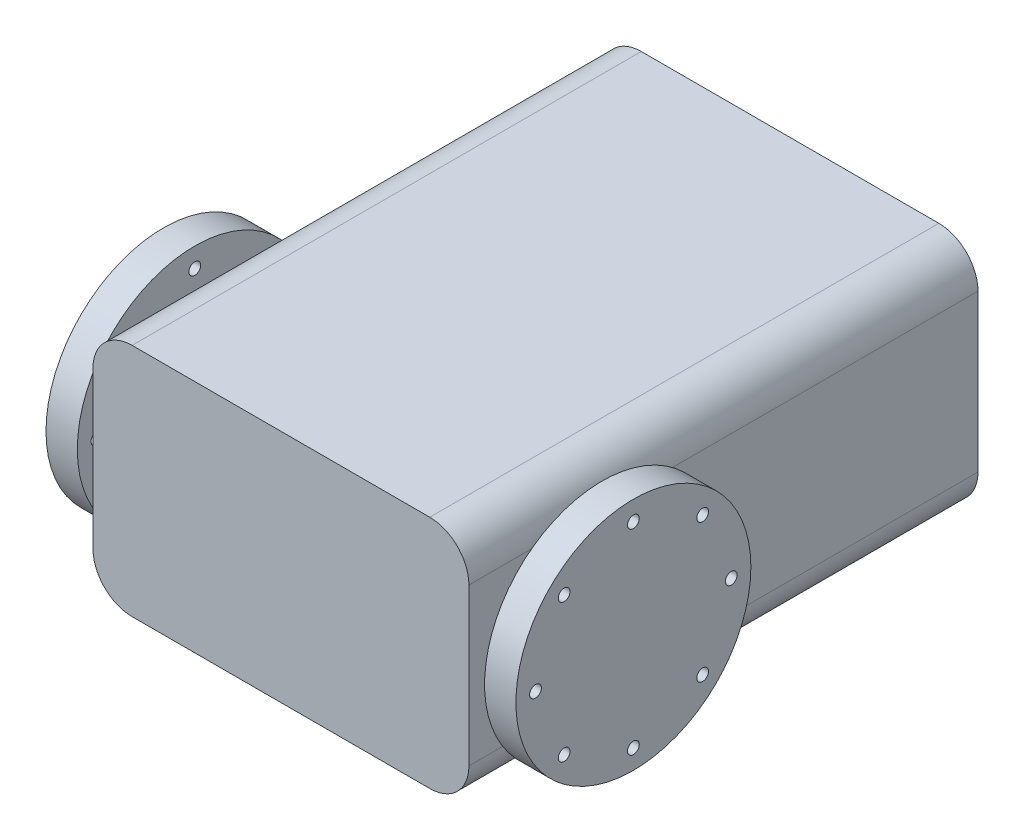
ISO-10303-21;
HEADER;
FILE_DESCRIPTION(('STEP AP214'),'2;1');
FILE_NAME('part.step','',(''),(''),'','','');
FILE_SCHEMA(('AUTOMOTIVE_DESIGN { 1 0 10303 214 1 1 1 1 }'));
ENDSEC;
DATA;
#1=APPLICATION_CONTEXT('core data for automotive mechanical design processes');
#2=APPLICATION_PROTOCOL_DEFINITION('international standard','automotive_design',2000,#1);
#3=PRODUCT_CONTEXT('',#1,'mechanical');
#4=PRODUCT('Part','Part','',(#3));
#5=PRODUCT_RELATED_PRODUCT_CATEGORY('part','',(#4));
#6=PRODUCT_DEFINITION_FORMATION('','',#4);
#7=PRODUCT_DEFINITION_CONTEXT('part definition',#1,'design');
#8=PRODUCT_DEFINITION('design','',#6,#7);
#9=PRODUCT_DEFINITION_SHAPE('','',#8);
#10=(LENGTH_UNIT() NAMED_UNIT(*) SI_UNIT(.MILLI.,.METRE.));
#11=(NAMED_UNIT(*) PLANE_ANGLE_UNIT() SI_UNIT($,.RADIAN.));
#12=(NAMED_UNIT(*) SI_UNIT($,.STERADIAN.) SOLID_ANGLE_UNIT());
#13=UNCERTAINTY_MEASURE_WITH_UNIT(LENGTH_MEASURE(1.E-05),#10,'distance_accuracy_value','');
#14=(GEOMETRIC_REPRESENTATION_CONTEXT(3) GLOBAL_UNCERTAINTY_ASSIGNED_CONTEXT((#13)) GLOBAL_UNIT_ASSIGNED_CONTEXT((#10,
#11,#12)) REPRESENTATION_CONTEXT('',''));
#15=CARTESIAN_POINT('',(0.,0.,0.));
#16=DIRECTION('',(0.,0.,1.));
#17=DIRECTION('',(1.,0.,0.));
#18=AXIS2_PLACEMENT_3D('',#15,#16,#17);
#19=CARTESIAN_POINT('',(19.,10.,32.5));
#20=DIRECTION('',(0.,0.,-1.));
#21=DIRECTION('',(-1.,0.,0.));
#22=AXIS2_PLACEMENT_3D('',#19,#20,#21);
#23=CYLINDRICAL_SURFACE('',#22,5.);
#24=CARTESIAN_POINT('',(19.,10.,-32.5));
#25=DIRECTION('',(0.,0.,1.));
#26=DIRECTION('',(-1.,0.,0.));
#27=AXIS2_PLACEMENT_3D('',#24,#25,#26);
#28=CIRCLE('',#27,5.);
#29=CARTESIAN_POINT('',(24.,10.,-32.5));
#30=VERTEX_POINT('',#29);
#31=CARTESIAN_POINT('',(19.,15.,-32.5));
#32=VERTEX_POINT('',#31);
#33=EDGE_CURVE('E134',#30,#32,#28,.T.);
#34=ORIENTED_EDGE('',*,*,#33,.T.);
#35=DIRECTION('',(0.,0.,-1.));
#36=VECTOR('',#35,1.);
#37=CARTESIAN_POINT('',(19.,15.,32.5));
#38=LINE('',#37,#36);
#39=CARTESIAN_POINT('',(19.,15.,32.5));
#40=VERTEX_POINT('',#39);
#41=EDGE_CURVE('E45',#40,#32,#38,.T.);
#42=ORIENTED_EDGE('',*,*,#41,.F.);
#43=CARTESIAN_POINT('',(19.,10.,32.5));
#44=DIRECTION('',(0.,0.,1.));
#45=DIRECTION('',(-1.,0.,0.));
#46=AXIS2_PLACEMENT_3D('',#43,#44,#45);
#47=CIRCLE('',#46,5.);
#48=CARTESIAN_POINT('',(24.,10.,32.5));
#49=VERTEX_POINT('',#48);
#50=EDGE_CURVE('E149',#49,#40,#47,.T.);
#51=ORIENTED_EDGE('',*,*,#50,.F.);
#52=DIRECTION('',(0.,0.,-1.));
#53=VECTOR('',#52,1.);
#54=CARTESIAN_POINT('',(24.,10.,32.5));
#55=LINE('',#54,#53);
#56=EDGE_CURVE('E130',#49,#30,#55,.T.);
#57=ORIENTED_EDGE('',*,*,#56,.T.);
#58=EDGE_LOOP('',(#34,#42,#51,#57));
#59=FACE_BOUND('',#58,.T.);
#60=ADVANCED_FACE('F37',(#59),#23,.T.);
#61=CARTESIAN_POINT('',(-19.,15.,32.5));
#62=DIRECTION('',(0.,-1.,0.));
#63=DIRECTION('',(0.,0.,-1.));
#64=AXIS2_PLACEMENT_3D('',#61,#62,#63);
#65=PLANE('',#64);
#66=DIRECTION('',(-1.,0.,0.));
#67=VECTOR('',#66,1.);
#68=CARTESIAN_POINT('',(-19.,15.,-32.5));
#69=LINE('',#68,#67);
#70=CARTESIAN_POINT('',(-19.,15.,-32.5));
#71=VERTEX_POINT('',#70);
#72=EDGE_CURVE('E137',#32,#71,#69,.T.);
#73=ORIENTED_EDGE('',*,*,#72,.T.);
#74=DIRECTION('',(0.,0.,-1.));
#75=VECTOR('',#74,1.);
#76=CARTESIAN_POINT('',(-19.,15.,32.5));
#77=LINE('',#76,#75);
#78=CARTESIAN_POINT('',(-19.,15.,32.5));
#79=VERTEX_POINT('',#78);
#80=EDGE_CURVE('E159',#79,#71,#77,.T.);
#81=ORIENTED_EDGE('',*,*,#80,.F.);
#82=DIRECTION('',(-1.,0.,0.));
#83=VECTOR('',#82,1.);
#84=CARTESIAN_POINT('',(-19.,15.,32.5));
#85=LINE('',#84,#83);
#86=EDGE_CURVE('E97',#40,#79,#85,.T.);
#87=ORIENTED_EDGE('',*,*,#86,.F.);
#88=ORIENTED_EDGE('',*,*,#41,.T.);
#89=EDGE_LOOP('',(#73,#81,#87,#88));
#90=FACE_BOUND('',#89,.T.);
#91=ADVANCED_FACE('F162',(#90),#65,.F.);
#92=CARTESIAN_POINT('',(-19.,10.,32.5));
#93=DIRECTION('',(0.,0.,-1.));
#94=DIRECTION('',(-1.,0.,0.));
#95=AXIS2_PLACEMENT_3D('',#92,#93,#94);
#96=CYLINDRICAL_SURFACE('',#95,5.);
#97=CARTESIAN_POINT('',(-19.,10.,-32.5));
#98=DIRECTION('',(0.,0.,1.));
#99=DIRECTION('',(1.,0.,0.));
#100=AXIS2_PLACEMENT_3D('',#97,#98,#99);
#101=CIRCLE('',#100,5.);
#102=CARTESIAN_POINT('',(-24.,10.,-32.5));
#103=VERTEX_POINT('',#102);
#104=EDGE_CURVE('E140',#71,#103,#101,.T.);
#105=ORIENTED_EDGE('',*,*,#104,.T.);
#106=DIRECTION('',(0.,0.,-1.));
#107=VECTOR('',#106,1.);
#108=CARTESIAN_POINT('',(-24.,10.,32.5));
#109=LINE('',#108,#107);
#110=CARTESIAN_POINT('',(-24.,10.,32.5));
#111=VERTEX_POINT('',#110);
#112=EDGE_CURVE('E156',#111,#103,#109,.T.);
#113=ORIENTED_EDGE('',*,*,#112,.F.);
#114=CARTESIAN_POINT('',(-19.,10.,32.5));
#115=DIRECTION('',(0.,0.,1.));
#116=DIRECTION('',(1.,0.,0.));
#117=AXIS2_PLACEMENT_3D('',#114,#115,#116);
#118=CIRCLE('',#117,5.);
#119=EDGE_CURVE('E180',#79,#111,#118,.T.);
#120=ORIENTED_EDGE('',*,*,#119,.F.);
#121=ORIENTED_EDGE('',*,*,#80,.T.);
#122=EDGE_LOOP('',(#105,#113,#120,#121));
#123=FACE_BOUND('',#122,.T.);
#124=ADVANCED_FACE('F173',(#123),#96,.T.);
#125=CARTESIAN_POINT('',(-24.,-10.,32.5));
#126=DIRECTION('',(1.,0.,0.));
#127=DIRECTION('',(0.,0.,-1.));
#128=AXIS2_PLACEMENT_3D('',#125,#126,#127);
#129=PLANE('',#128);
#130=CARTESIAN_POINT('',(-24.,0.,17.5));
#131=DIRECTION('',(1.,0.,0.));
#132=DIRECTION('',(0.,0.,-1.));
#133=AXIS2_PLACEMENT_3D('',#130,#131,#132);
#134=CIRCLE('',#133,7.5);
#135=CARTESIAN_POINT('',(-24.,0.,10.));
#136=VERTEX_POINT('',#135);
#137=EDGE_CURVE('E192',#136,#136,#134,.T.);
#138=ORIENTED_EDGE('',*,*,#137,.T.);
#139=EDGE_LOOP('',(#138));
#140=FACE_BOUND('',#139,.T.);
#141=DIRECTION('',(0.,-1.,0.));
#142=VECTOR('',#141,1.);
#143=CARTESIAN_POINT('',(-24.,-10.,-32.5));
#144=LINE('',#143,#142);
#145=CARTESIAN_POINT('',(-24.,-10.,-32.5));
#146=VERTEX_POINT('',#145);
#147=EDGE_CURVE('E142',#103,#146,#144,.T.);
#148=ORIENTED_EDGE('',*,*,#147,.T.);
#149=DIRECTION('',(0.,0.,-1.));
#150=VECTOR('',#149,1.);
#151=CARTESIAN_POINT('',(-24.,-10.,32.5));
#152=LINE('',#151,#150);
#153=CARTESIAN_POINT('',(-24.,-10.,32.5));
#154=VERTEX_POINT('',#153);
#155=EDGE_CURVE('E153',#154,#146,#152,.T.);
#156=ORIENTED_EDGE('',*,*,#155,.F.);
#157=DIRECTION('',(0.,-1.,0.));
#158=VECTOR('',#157,1.);
#159=CARTESIAN_POINT('',(-24.,-10.,32.5));
#160=LINE('',#159,#158);
#161=EDGE_CURVE('E179',#111,#154,#160,.T.);
#162=ORIENTED_EDGE('',*,*,#161,.F.);
#163=ORIENTED_EDGE('',*,*,#112,.T.);
#164=EDGE_LOOP('',(#148,#156,#162,#163));
#165=FACE_BOUND('',#164,.T.);
#166=ADVANCED_FACE('F177',(#140,#165),#129,.F.);
#167=CARTESIAN_POINT('',(-19.,-10.,32.5));
#168=DIRECTION('',(0.,0.,-1.));
#169=DIRECTION('',(-1.,0.,0.));
#170=AXIS2_PLACEMENT_3D('',#167,#168,#169);
#171=CYLINDRICAL_SURFACE('',#170,5.);
#172=CARTESIAN_POINT('',(-19.,-10.,-32.5));
#173=DIRECTION('',(0.,0.,1.));
#174=DIRECTION('',(-1.,0.,0.));
#175=AXIS2_PLACEMENT_3D('',#172,#173,#174);
#176=CIRCLE('',#175,5.);
#177=CARTESIAN_POINT('',(-19.,-15.,-32.5));
#178=VERTEX_POINT('',#177);
#179=EDGE_CURVE('E144',#146,#178,#176,.T.);
#180=ORIENTED_EDGE('',*,*,#179,.T.);
#181=DIRECTION('',(0.,0.,-1.));
#182=VECTOR('',#181,1.);
#183=CARTESIAN_POINT('',(-19.,-15.,32.5));
#184=LINE('',#183,#182);
#185=CARTESIAN_POINT('',(-19.,-15.,32.5));
#186=VERTEX_POINT('',#185);
#187=EDGE_CURVE('E125',#186,#178,#184,.T.);
#188=ORIENTED_EDGE('',*,*,#187,.F.);
#189=CARTESIAN_POINT('',(-19.,-10.,32.5));
#190=DIRECTION('',(0.,0.,1.));
#191=DIRECTION('',(-1.,0.,0.));
#192=AXIS2_PLACEMENT_3D('',#189,#190,#191);
#193=CIRCLE('',#192,5.);
#194=EDGE_CURVE('E116',#154,#186,#193,.T.);
#195=ORIENTED_EDGE('',*,*,#194,.F.);
#196=ORIENTED_EDGE('',*,*,#155,.T.);
#197=EDGE_LOOP('',(#180,#188,#195,#196));
#198=FACE_BOUND('',#197,.T.);
#199=ADVANCED_FACE('F350',(#198),#171,.T.);
#200=CARTESIAN_POINT('',(-19.,-15.,32.5));
#201=DIRECTION('',(0.,1.,0.));
#202=DIRECTION('',(0.,0.,1.));
#203=AXIS2_PLACEMENT_3D('',#200,#201,#202);
#204=PLANE('',#203);
#205=DIRECTION('',(1.,0.,0.));
#206=VECTOR('',#205,1.);
#207=CARTESIAN_POINT('',(-19.,-15.,-32.5));
#208=LINE('',#207,#206);
#209=CARTESIAN_POINT('',(19.,-15.,-32.5));
#210=VERTEX_POINT('',#209);
#211=EDGE_CURVE('E124',#178,#210,#208,.T.);
#212=ORIENTED_EDGE('',*,*,#211,.T.);
#213=DIRECTION('',(0.,0.,-1.));
#214=VECTOR('',#213,1.);
#215=CARTESIAN_POINT('',(19.,-15.,32.5));
#216=LINE('',#215,#214);
#217=CARTESIAN_POINT('',(19.,-15.,32.5));
#218=VERTEX_POINT('',#217);
#219=EDGE_CURVE('E121',#218,#210,#216,.T.);
#220=ORIENTED_EDGE('',*,*,#219,.F.);
#221=DIRECTION('',(1.,0.,0.));
#222=VECTOR('',#221,1.);
#223=CARTESIAN_POINT('',(-19.,-15.,32.5));
#224=LINE('',#223,#222);
#225=EDGE_CURVE('E110',#186,#218,#224,.T.);
#226=ORIENTED_EDGE('',*,*,#225,.F.);
#227=ORIENTED_EDGE('',*,*,#187,.T.);
#228=EDGE_LOOP('',(#212,#220,#226,#227));
#229=FACE_BOUND('',#228,.T.);
#230=ADVANCED_FACE('F122',(#229),#204,.F.);
#231=CARTESIAN_POINT('',(19.,-10.,32.5));
#232=DIRECTION('',(0.,0.,-1.));
#233=DIRECTION('',(-1.,0.,0.));
#234=AXIS2_PLACEMENT_3D('',#231,#232,#233);
#235=CYLINDRICAL_SURFACE('',#234,5.);
#236=CARTESIAN_POINT('',(19.,-10.,-32.5));
#237=DIRECTION('',(0.,0.,1.));
#238=DIRECTION('',(1.,0.,0.));
#239=AXIS2_PLACEMENT_3D('',#236,#237,#238);
#240=CIRCLE('',#239,5.);
#241=CARTESIAN_POINT('',(24.,-10.,-32.5));
#242=VERTEX_POINT('',#241);
#243=EDGE_CURVE('E82',#210,#242,#240,.T.);
#244=ORIENTED_EDGE('',*,*,#243,.T.);
#245=DIRECTION('',(0.,0.,-1.));
#246=VECTOR('',#245,1.);
#247=CARTESIAN_POINT('',(24.,-10.,32.5));
#248=LINE('',#247,#246);
#249=CARTESIAN_POINT('',(24.,-10.,32.5));
#250=VERTEX_POINT('',#249);
#251=EDGE_CURVE('E126',#250,#242,#248,.T.);
#252=ORIENTED_EDGE('',*,*,#251,.F.);
#253=CARTESIAN_POINT('',(19.,-10.,32.5));
#254=DIRECTION('',(0.,0.,1.));
#255=DIRECTION('',(1.,0.,0.));
#256=AXIS2_PLACEMENT_3D('',#253,#254,#255);
#257=CIRCLE('',#256,5.);
#258=EDGE_CURVE('E114',#218,#250,#257,.T.);
#259=ORIENTED_EDGE('',*,*,#258,.F.);
#260=ORIENTED_EDGE('',*,*,#219,.T.);
#261=EDGE_LOOP('',(#244,#252,#259,#260));
#262=FACE_BOUND('',#261,.T.);
#263=ADVANCED_FACE('F128',(#262),#235,.T.);
#264=CARTESIAN_POINT('',(24.,-10.,32.5));
#265=DIRECTION('',(-1.,0.,0.));
#266=DIRECTION('',(0.,0.,1.));
#267=AXIS2_PLACEMENT_3D('',#264,#265,#266);
#268=PLANE('',#267);
#269=CARTESIAN_POINT('',(24.,0.,17.5));
#270=DIRECTION('',(-1.,0.,0.));
#271=DIRECTION('',(0.,0.,1.));
#272=AXIS2_PLACEMENT_3D('',#269,#270,#271);
#273=CIRCLE('',#272,7.5);
#274=CARTESIAN_POINT('',(24.,0.,25.));
#275=VERTEX_POINT('',#274);
#276=EDGE_CURVE('E11',#275,#275,#273,.F.);
#277=ORIENTED_EDGE('',*,*,#276,.F.);
#278=EDGE_LOOP('',(#277));
#279=FACE_BOUND('',#278,.T.);
#280=DIRECTION('',(0.,1.,0.));
#281=VECTOR('',#280,1.);
#282=CARTESIAN_POINT('',(24.,-10.,-32.5));
#283=LINE('',#282,#281);
#284=EDGE_CURVE('E88',#242,#30,#283,.T.);
#285=ORIENTED_EDGE('',*,*,#284,.T.);
#286=ORIENTED_EDGE('',*,*,#56,.F.);
#287=DIRECTION('',(0.,1.,0.));
#288=VECTOR('',#287,1.);
#289=CARTESIAN_POINT('',(24.,-10.,32.5));
#290=LINE('',#289,#288);
#291=EDGE_CURVE('E53',#250,#49,#290,.T.);
#292=ORIENTED_EDGE('',*,*,#291,.F.);
#293=ORIENTED_EDGE('',*,*,#251,.T.);
#294=EDGE_LOOP('',(#285,#286,#292,#293));
#295=FACE_BOUND('',#294,.T.);
#296=ADVANCED_FACE('F359',(#279,#295),#268,.F.);
#297=CARTESIAN_POINT('',(19.,10.,32.5));
#298=DIRECTION('',(0.,0.,-1.));
#299=DIRECTION('',(-1.,0.,0.));
#300=AXIS2_PLACEMENT_3D('',#297,#298,#299);
#301=PLANE('',#300);
#302=ORIENTED_EDGE('',*,*,#50,.T.);
#303=ORIENTED_EDGE('',*,*,#86,.T.);
#304=ORIENTED_EDGE('',*,*,#119,.T.);
#305=ORIENTED_EDGE('',*,*,#161,.T.);
#306=ORIENTED_EDGE('',*,*,#194,.T.);
#307=ORIENTED_EDGE('',*,*,#225,.T.);
#308=ORIENTED_EDGE('',*,*,#258,.T.);
#309=ORIENTED_EDGE('',*,*,#291,.T.);
#310=EDGE_LOOP('',(#302,#303,#304,#305,#306,#307,#308,#309));
#311=FACE_BOUND('',#310,.T.);
#312=ADVANCED_FACE('F112',(#311),#301,.F.);
#313=CARTESIAN_POINT('',(19.,10.,-32.5));
#314=DIRECTION('',(0.,0.,-1.));
#315=DIRECTION('',(-1.,0.,0.));
#316=AXIS2_PLACEMENT_3D('',#313,#314,#315);
#317=PLANE('',#316);
#318=ORIENTED_EDGE('',*,*,#33,.F.);
#319=ORIENTED_EDGE('',*,*,#284,.F.);
#320=ORIENTED_EDGE('',*,*,#243,.F.);
#321=ORIENTED_EDGE('',*,*,#211,.F.);
#322=ORIENTED_EDGE('',*,*,#179,.F.);
#323=ORIENTED_EDGE('',*,*,#147,.F.);
#324=ORIENTED_EDGE('',*,*,#104,.F.);
#325=ORIENTED_EDGE('',*,*,#72,.F.);
#326=EDGE_LOOP('',(#318,#319,#320,#321,#322,#323,#324,#325));
#327=FACE_BOUND('',#326,.T.);
#328=ADVANCED_FACE('F167',(#327),#317,.T.);
#329=CARTESIAN_POINT('',(2.78679656440357,0.,17.5));
#330=DIRECTION('',(1.,0.,0.));
#331=DIRECTION('',(0.,0.,-1.));
#332=AXIS2_PLACEMENT_3D('',#329,#330,#331);
#333=CYLINDRICAL_SURFACE('',#332,7.5);
#334=CARTESIAN_POINT('',(26.,0.,17.5));
#335=DIRECTION('',(1.,0.,0.));
#336=DIRECTION('',(0.,0.,-1.));
#337=AXIS2_PLACEMENT_3D('',#334,#335,#336);
#338=CIRCLE('',#337,7.5);
#339=CARTESIAN_POINT('',(26.,0.,10.));
#340=VERTEX_POINT('',#339);
#341=EDGE_CURVE('E138',#340,#340,#338,.T.);
#342=ORIENTED_EDGE('',*,*,#341,.F.);
#343=EDGE_LOOP('',(#342));
#344=FACE_BOUND('',#343,.T.);
#345=ORIENTED_EDGE('',*,*,#276,.T.);
#346=EDGE_LOOP('',(#345));
#347=FACE_BOUND('',#346,.T.);
#348=ADVANCED_FACE('F365',(#344,#347),#333,.T.);
#349=CARTESIAN_POINT('',(30.,0.,17.5));
#350=DIRECTION('',(-1.,0.,0.));
#351=DIRECTION('',(0.,0.,1.));
#352=AXIS2_PLACEMENT_3D('',#349,#350,#351);
#353=CYLINDRICAL_SURFACE('',#352,15.);
#354=CARTESIAN_POINT('',(30.,0.,17.5));
#355=DIRECTION('',(1.,0.,0.));
#356=DIRECTION('',(0.,0.,-1.));
#357=AXIS2_PLACEMENT_3D('',#354,#355,#356);
#358=CIRCLE('',#357,15.);
#359=CARTESIAN_POINT('',(30.,0.,2.5));
#360=VERTEX_POINT('',#359);
#361=EDGE_CURVE('E188',#360,#360,#358,.T.);
#362=ORIENTED_EDGE('',*,*,#361,.F.);
#363=EDGE_LOOP('',(#362));
#364=FACE_BOUND('',#363,.T.);
#365=CARTESIAN_POINT('',(26.,0.,17.5));
#366=DIRECTION('',(1.,0.,0.));
#367=DIRECTION('',(0.,0.,-1.));
#368=AXIS2_PLACEMENT_3D('',#365,#366,#367);
#369=CIRCLE('',#368,15.);
#370=CARTESIAN_POINT('',(26.,0.,2.5));
#371=VERTEX_POINT('',#370);
#372=EDGE_CURVE('E189',#371,#371,#369,.T.);
#373=ORIENTED_EDGE('',*,*,#372,.T.);
#374=EDGE_LOOP('',(#373));
#375=FACE_BOUND('',#374,.T.);
#376=ADVANCED_FACE('F370',(#364,#375),#353,.T.);
#377=CARTESIAN_POINT('',(30.,0.,17.5));
#378=DIRECTION('',(1.,0.,0.));
#379=DIRECTION('',(0.,0.,-1.));
#380=AXIS2_PLACEMENT_3D('',#377,#378,#379);
#381=PLANE('',#380);
#382=CARTESIAN_POINT('',(30.,-8.83883476483185,26.3388347648318));
#383=DIRECTION('',(1.,0.,0.));
#384=DIRECTION('',(0.,0.,-1.));
#385=AXIS2_PLACEMENT_3D('',#382,#383,#384);
#386=CIRCLE('',#385,0.750000000000002);
#387=CARTESIAN_POINT('',(30.,-8.83883476483185,25.5888347648318));
#388=VERTEX_POINT('',#387);
#389=EDGE_CURVE('E231',#388,#388,#386,.T.);
#390=ORIENTED_EDGE('',*,*,#389,.F.);
#391=EDGE_LOOP('',(#390));
#392=FACE_BOUND('',#391,.T.);
#393=CARTESIAN_POINT('',(30.,-12.5,17.5));
#394=DIRECTION('',(1.,0.,0.));
#395=DIRECTION('',(0.,0.,-1.));
#396=AXIS2_PLACEMENT_3D('',#393,#394,#395);
#397=CIRCLE('',#396,0.750000000000005);
#398=CARTESIAN_POINT('',(30.,-12.5,16.75));
#399=VERTEX_POINT('',#398);
#400=EDGE_CURVE('E239',#399,#399,#397,.T.);
#401=ORIENTED_EDGE('',*,*,#400,.F.);
#402=EDGE_LOOP('',(#401));
#403=FACE_BOUND('',#402,.T.);
#404=CARTESIAN_POINT('',(30.,-8.83883476483184,8.66116523516816));
#405=DIRECTION('',(1.,0.,0.));
#406=DIRECTION('',(0.,0.,-1.));
#407=AXIS2_PLACEMENT_3D('',#404,#405,#406);
#408=CIRCLE('',#407,0.750000000000002);
#409=CARTESIAN_POINT('',(30.,-8.83883476483184,7.91116523516816));
#410=VERTEX_POINT('',#409);
#411=EDGE_CURVE('E245',#410,#410,#408,.T.);
#412=ORIENTED_EDGE('',*,*,#411,.F.);
#413=EDGE_LOOP('',(#412));
#414=FACE_BOUND('',#413,.T.);
#415=CARTESIAN_POINT('',(30.,0.,5.));
#416=DIRECTION('',(1.,0.,0.));
#417=DIRECTION('',(0.,0.,-1.));
#418=AXIS2_PLACEMENT_3D('',#415,#416,#417);
#419=CIRCLE('',#418,0.750000000000001);
#420=CARTESIAN_POINT('',(30.,0.,4.25));
#421=VERTEX_POINT('',#420);
#422=EDGE_CURVE('E220',#421,#421,#419,.T.);
#423=ORIENTED_EDGE('',*,*,#422,.F.);
#424=EDGE_LOOP('',(#423));
#425=FACE_BOUND('',#424,.T.);
#426=CARTESIAN_POINT('',(30.,8.83883476483185,8.66116523516816));
#427=DIRECTION('',(1.,0.,0.));
#428=DIRECTION('',(0.,0.,-1.));
#429=AXIS2_PLACEMENT_3D('',#426,#427,#428);
#430=CIRCLE('',#429,0.750000000000002);
#431=CARTESIAN_POINT('',(30.,8.83883476483185,7.91116523516816));
#432=VERTEX_POINT('',#431);
#433=EDGE_CURVE('E213',#432,#432,#430,.T.);
#434=ORIENTED_EDGE('',*,*,#433,.F.);
#435=EDGE_LOOP('',(#434));
#436=FACE_BOUND('',#435,.T.);
#437=CARTESIAN_POINT('',(30.,12.5,17.5));
#438=DIRECTION('',(1.,0.,0.));
#439=DIRECTION('',(0.,0.,-1.));
#440=AXIS2_PLACEMENT_3D('',#437,#438,#439);
#441=CIRCLE('',#440,0.750000000000002);
#442=CARTESIAN_POINT('',(30.,12.5,16.75));
#443=VERTEX_POINT('',#442);
#444=EDGE_CURVE('E221',#443,#443,#441,.T.);
#445=ORIENTED_EDGE('',*,*,#444,.F.);
#446=EDGE_LOOP('',(#445));
#447=FACE_BOUND('',#446,.T.);
#448=CARTESIAN_POINT('',(30.,0.,30.));
#449=DIRECTION('',(1.,0.,0.));
#450=DIRECTION('',(0.,0.,-1.));
#451=AXIS2_PLACEMENT_3D('',#448,#449,#450);
#452=CIRCLE('',#451,0.750000000000002);
#453=CARTESIAN_POINT('',(30.,0.,29.25));
#454=VERTEX_POINT('',#453);
#455=EDGE_CURVE('E212',#454,#454,#452,.T.);
#456=ORIENTED_EDGE('',*,*,#455,.F.);
#457=EDGE_LOOP('',(#456));
#458=FACE_BOUND('',#457,.T.);
#459=CARTESIAN_POINT('',(30.,8.83883476483184,26.3388347648318));
#460=DIRECTION('',(1.,0.,0.));
#461=DIRECTION('',(0.,0.,-1.));
#462=AXIS2_PLACEMENT_3D('',#459,#460,#461);
#463=CIRCLE('',#462,0.750000000000005);
#464=CARTESIAN_POINT('',(30.,8.83883476483184,25.5888347648318));
#465=VERTEX_POINT('',#464);
#466=EDGE_CURVE('E209',#465,#465,#463,.T.);
#467=ORIENTED_EDGE('',*,*,#466,.F.);
#468=EDGE_LOOP('',(#467));
#469=FACE_BOUND('',#468,.T.);
#470=ORIENTED_EDGE('',*,*,#361,.T.);
#471=EDGE_LOOP('',(#470));
#472=FACE_BOUND('',#471,.T.);
#473=ADVANCED_FACE('F374',(#392,#403,#414,#425,#436,#447,#458,#469,#472),#381,.T.);
#474=CARTESIAN_POINT('',(26.,0.,17.5));
#475=DIRECTION('',(1.,0.,0.));
#476=DIRECTION('',(0.,0.,-1.));
#477=AXIS2_PLACEMENT_3D('',#474,#475,#476);
#478=PLANE('',#477);
#479=CARTESIAN_POINT('',(26.,-8.83883476483185,26.3388347648318));
#480=DIRECTION('',(1.,0.,0.));
#481=DIRECTION('',(0.,0.,-1.));
#482=AXIS2_PLACEMENT_3D('',#479,#480,#481);
#483=CIRCLE('',#482,0.750000000000002);
#484=CARTESIAN_POINT('',(26.,-8.83883476483185,25.5888347648318));
#485=VERTEX_POINT('',#484);
#486=EDGE_CURVE('E235',#485,#485,#483,.F.);
#487=ORIENTED_EDGE('',*,*,#486,.F.);
#488=EDGE_LOOP('',(#487));
#489=FACE_BOUND('',#488,.T.);
#490=CARTESIAN_POINT('',(26.,-12.5,17.5));
#491=DIRECTION('',(1.,0.,0.));
#492=DIRECTION('',(0.,0.,-1.));
#493=AXIS2_PLACEMENT_3D('',#490,#491,#492);
#494=CIRCLE('',#493,0.750000000000005);
#495=CARTESIAN_POINT('',(26.,-12.5,16.75));
#496=VERTEX_POINT('',#495);
#497=EDGE_CURVE('E234',#496,#496,#494,.F.);
#498=ORIENTED_EDGE('',*,*,#497,.F.);
#499=EDGE_LOOP('',(#498));
#500=FACE_BOUND('',#499,.T.);
#501=CARTESIAN_POINT('',(26.,-8.83883476483184,8.66116523516816));
#502=DIRECTION('',(1.,0.,0.));
#503=DIRECTION('',(0.,0.,-1.));
#504=AXIS2_PLACEMENT_3D('',#501,#502,#503);
#505=CIRCLE('',#504,0.750000000000002);
#506=CARTESIAN_POINT('',(26.,-8.83883476483184,7.91116523516816));
#507=VERTEX_POINT('',#506);
#508=EDGE_CURVE('E242',#507,#507,#505,.F.);
#509=ORIENTED_EDGE('',*,*,#508,.F.);
#510=EDGE_LOOP('',(#509));
#511=FACE_BOUND('',#510,.T.);
#512=CARTESIAN_POINT('',(26.,0.,5.));
#513=DIRECTION('',(1.,0.,0.));
#514=DIRECTION('',(0.,0.,-1.));
#515=AXIS2_PLACEMENT_3D('',#512,#513,#514);
#516=CIRCLE('',#515,0.750000000000001);
#517=CARTESIAN_POINT('',(26.,0.,4.25));
#518=VERTEX_POINT('',#517);
#519=EDGE_CURVE('E248',#518,#518,#516,.F.);
#520=ORIENTED_EDGE('',*,*,#519,.F.);
#521=EDGE_LOOP('',(#520));
#522=FACE_BOUND('',#521,.T.);
#523=CARTESIAN_POINT('',(26.,8.83883476483185,8.66116523516816));
#524=DIRECTION('',(1.,0.,0.));
#525=DIRECTION('',(0.,0.,-1.));
#526=AXIS2_PLACEMENT_3D('',#523,#524,#525);
#527=CIRCLE('',#526,0.750000000000002);
#528=CARTESIAN_POINT('',(26.,8.83883476483185,7.91116523516816));
#529=VERTEX_POINT('',#528);
#530=EDGE_CURVE('E217',#529,#529,#527,.F.);
#531=ORIENTED_EDGE('',*,*,#530,.F.);
#532=EDGE_LOOP('',(#531));
#533=FACE_BOUND('',#532,.T.);
#534=CARTESIAN_POINT('',(26.,12.5,17.5));
#535=DIRECTION('',(1.,0.,0.));
#536=DIRECTION('',(0.,0.,-1.));
#537=AXIS2_PLACEMENT_3D('',#534,#535,#536);
#538=CIRCLE('',#537,0.750000000000002);
#539=CARTESIAN_POINT('',(26.,12.5,16.75));
#540=VERTEX_POINT('',#539);
#541=EDGE_CURVE('E216',#540,#540,#538,.F.);
#542=ORIENTED_EDGE('',*,*,#541,.F.);
#543=EDGE_LOOP('',(#542));
#544=FACE_BOUND('',#543,.T.);
#545=CARTESIAN_POINT('',(26.,0.,30.));
#546=DIRECTION('',(1.,0.,0.));
#547=DIRECTION('',(0.,0.,-1.));
#548=AXIS2_PLACEMENT_3D('',#545,#546,#547);
#549=CIRCLE('',#548,0.750000000000002);
#550=CARTESIAN_POINT('',(26.,0.,29.25));
#551=VERTEX_POINT('',#550);
#552=EDGE_CURVE('E224',#551,#551,#549,.F.);
#553=ORIENTED_EDGE('',*,*,#552,.F.);
#554=EDGE_LOOP('',(#553));
#555=FACE_BOUND('',#554,.T.);
#556=CARTESIAN_POINT('',(26.,8.83883476483184,26.3388347648318));
#557=DIRECTION('',(1.,0.,0.));
#558=DIRECTION('',(0.,0.,-1.));
#559=AXIS2_PLACEMENT_3D('',#556,#557,#558);
#560=CIRCLE('',#559,0.750000000000005);
#561=CARTESIAN_POINT('',(26.,8.83883476483184,25.5888347648318));
#562=VERTEX_POINT('',#561);
#563=EDGE_CURVE('E204',#562,#562,#560,.F.);
#564=ORIENTED_EDGE('',*,*,#563,.F.);
#565=EDGE_LOOP('',(#564));
#566=FACE_BOUND('',#565,.T.);
#567=ORIENTED_EDGE('',*,*,#341,.T.);
#568=EDGE_LOOP('',(#567));
#569=FACE_BOUND('',#568,.T.);
#570=ORIENTED_EDGE('',*,*,#372,.F.);
#571=EDGE_LOOP('',(#570));
#572=FACE_BOUND('',#571,.T.);
#573=ADVANCED_FACE('F376',(#489,#500,#511,#522,#533,#544,#555,#566,#569,#572),#478,.F.);
#574=CARTESIAN_POINT('',(45.2132034355964,0.,17.5));
#575=DIRECTION('',(-1.,0.,0.));
#576=DIRECTION('',(0.,0.,1.));
#577=AXIS2_PLACEMENT_3D('',#574,#575,#576);
#578=CYLINDRICAL_SURFACE('',#577,7.5);
#579=CARTESIAN_POINT('',(-26.,0.,17.5));
#580=DIRECTION('',(-1.,0.,0.));
#581=DIRECTION('',(0.,0.,1.));
#582=AXIS2_PLACEMENT_3D('',#579,#580,#581);
#583=CIRCLE('',#582,7.5);
#584=CARTESIAN_POINT('',(-26.,0.,25.));
#585=VERTEX_POINT('',#584);
#586=EDGE_CURVE('E197',#585,#585,#583,.T.);
#587=ORIENTED_EDGE('',*,*,#586,.F.);
#588=EDGE_LOOP('',(#587));
#589=FACE_BOUND('',#588,.T.);
#590=ORIENTED_EDGE('',*,*,#137,.F.);
#591=EDGE_LOOP('',(#590));
#592=FACE_BOUND('',#591,.T.);
#593=ADVANCED_FACE('F324',(#589,#592),#578,.T.);
#594=CARTESIAN_POINT('',(-30.,0.,17.5));
#595=DIRECTION('',(1.,0.,0.));
#596=DIRECTION('',(0.,0.,-1.));
#597=AXIS2_PLACEMENT_3D('',#594,#595,#596);
#598=CYLINDRICAL_SURFACE('',#597,15.);
#599=CARTESIAN_POINT('',(-30.,0.,17.5));
#600=DIRECTION('',(-1.,0.,0.));
#601=DIRECTION('',(0.,0.,1.));
#602=AXIS2_PLACEMENT_3D('',#599,#600,#601);
#603=CIRCLE('',#602,15.);
#604=CARTESIAN_POINT('',(-30.,0.,32.5));
#605=VERTEX_POINT('',#604);
#606=EDGE_CURVE('E200',#605,#605,#603,.T.);
#607=ORIENTED_EDGE('',*,*,#606,.F.);
#608=EDGE_LOOP('',(#607));
#609=FACE_BOUND('',#608,.T.);
#610=CARTESIAN_POINT('',(-26.,0.,17.5));
#611=DIRECTION('',(-1.,0.,0.));
#612=DIRECTION('',(0.,0.,1.));
#613=AXIS2_PLACEMENT_3D('',#610,#611,#612);
#614=CIRCLE('',#613,15.);
#615=CARTESIAN_POINT('',(-26.,0.,32.5));
#616=VERTEX_POINT('',#615);
#617=EDGE_CURVE('E201',#616,#616,#614,.T.);
#618=ORIENTED_EDGE('',*,*,#617,.T.);
#619=EDGE_LOOP('',(#618));
#620=FACE_BOUND('',#619,.T.);
#621=ADVANCED_FACE('F309',(#609,#620),#598,.T.);
#622=CARTESIAN_POINT('',(-30.,0.,17.5));
#623=DIRECTION('',(-1.,0.,0.));
#624=DIRECTION('',(0.,0.,1.));
#625=AXIS2_PLACEMENT_3D('',#622,#623,#624);
#626=PLANE('',#625);
#627=CARTESIAN_POINT('',(-30.,0.,5.00000000000001));
#628=DIRECTION('',(-1.,0.,0.));
#629=DIRECTION('',(0.,0.,1.));
#630=AXIS2_PLACEMENT_3D('',#627,#628,#629);
#631=CIRCLE('',#630,0.75);
#632=CARTESIAN_POINT('',(-30.,0.,5.75000000000001));
#633=VERTEX_POINT('',#632);
#634=EDGE_CURVE('E282',#633,#633,#631,.T.);
#635=ORIENTED_EDGE('',*,*,#634,.F.);
#636=EDGE_LOOP('',(#635));
#637=FACE_BOUND('',#636,.T.);
#638=CARTESIAN_POINT('',(-30.,-8.83883476483184,8.66116523516816));
#639=DIRECTION('',(-1.,0.,0.));
#640=DIRECTION('',(0.,0.,1.));
#641=AXIS2_PLACEMENT_3D('',#638,#639,#640);
#642=CIRCLE('',#641,0.750000000000004);
#643=CARTESIAN_POINT('',(-30.,-8.83883476483184,9.41116523516816));
#644=VERTEX_POINT('',#643);
#645=EDGE_CURVE('E288',#644,#644,#642,.T.);
#646=ORIENTED_EDGE('',*,*,#645,.F.);
#647=EDGE_LOOP('',(#646));
#648=FACE_BOUND('',#647,.T.);
#649=CARTESIAN_POINT('',(-30.,-12.5,17.5));
#650=DIRECTION('',(-1.,0.,0.));
#651=DIRECTION('',(0.,0.,1.));
#652=AXIS2_PLACEMENT_3D('',#649,#650,#651);
#653=CIRCLE('',#652,0.750000000000005);
#654=CARTESIAN_POINT('',(-30.,-12.5,18.25));
#655=VERTEX_POINT('',#654);
#656=EDGE_CURVE('E294',#655,#655,#653,.T.);
#657=ORIENTED_EDGE('',*,*,#656,.F.);
#658=EDGE_LOOP('',(#657));
#659=FACE_BOUND('',#658,.T.);
#660=CARTESIAN_POINT('',(-30.,-8.83883476483184,26.3388347648318));
#661=DIRECTION('',(-1.,0.,0.));
#662=DIRECTION('',(0.,0.,1.));
#663=AXIS2_PLACEMENT_3D('',#660,#661,#662);
#664=CIRCLE('',#663,0.750000000000002);
#665=CARTESIAN_POINT('',(-30.,-8.83883476483184,27.0888347648318));
#666=VERTEX_POINT('',#665);
#667=EDGE_CURVE('E265',#666,#666,#664,.T.);
#668=ORIENTED_EDGE('',*,*,#667,.F.);
#669=EDGE_LOOP('',(#668));
#670=FACE_BOUND('',#669,.T.);
#671=CARTESIAN_POINT('',(-30.,0.,30.));
#672=DIRECTION('',(-1.,0.,0.));
#673=DIRECTION('',(0.,0.,1.));
#674=AXIS2_PLACEMENT_3D('',#671,#672,#673);
#675=CIRCLE('',#674,0.749999999999998);
#676=CARTESIAN_POINT('',(-30.,0.,30.75));
#677=VERTEX_POINT('',#676);
#678=EDGE_CURVE('E264',#677,#677,#675,.T.);
#679=ORIENTED_EDGE('',*,*,#678,.F.);
#680=EDGE_LOOP('',(#679));
#681=FACE_BOUND('',#680,.T.);
#682=CARTESIAN_POINT('',(-30.,8.83883476483184,26.3388347648318));
#683=DIRECTION('',(-1.,0.,0.));
#684=DIRECTION('',(0.,0.,1.));
#685=AXIS2_PLACEMENT_3D('',#682,#683,#684);
#686=CIRCLE('',#685,0.750000000000002);
#687=CARTESIAN_POINT('',(-30.,8.83883476483184,27.0888347648318));
#688=VERTEX_POINT('',#687);
#689=EDGE_CURVE('E271',#688,#688,#686,.T.);
#690=ORIENTED_EDGE('',*,*,#689,.F.);
#691=EDGE_LOOP('',(#690));
#692=FACE_BOUND('',#691,.T.);
#693=CARTESIAN_POINT('',(-30.,12.5,17.5));
#694=DIRECTION('',(-1.,0.,0.));
#695=DIRECTION('',(0.,0.,1.));
#696=AXIS2_PLACEMENT_3D('',#693,#694,#695);
#697=CIRCLE('',#696,0.750000000000002);
#698=CARTESIAN_POINT('',(-30.,12.5,18.25));
#699=VERTEX_POINT('',#698);
#700=EDGE_CURVE('E258',#699,#699,#697,.T.);
#701=ORIENTED_EDGE('',*,*,#700,.F.);
#702=EDGE_LOOP('',(#701));
#703=FACE_BOUND('',#702,.T.);
#704=CARTESIAN_POINT('',(-30.,8.83883476483184,8.66116523516816));
#705=DIRECTION('',(-1.,0.,0.));
#706=DIRECTION('',(0.,0.,1.));
#707=AXIS2_PLACEMENT_3D('',#704,#705,#706);
#708=CIRCLE('',#707,0.75);
#709=CARTESIAN_POINT('',(-30.,8.83883476483184,9.41116523516816));
#710=VERTEX_POINT('',#709);
#711=EDGE_CURVE('E255',#710,#710,#708,.T.);
#712=ORIENTED_EDGE('',*,*,#711,.F.);
#713=EDGE_LOOP('',(#712));
#714=FACE_BOUND('',#713,.T.);
#715=ORIENTED_EDGE('',*,*,#606,.T.);
#716=EDGE_LOOP('',(#715));
#717=FACE_BOUND('',#716,.T.);
#718=ADVANCED_FACE('F305',(#637,#648,#659,#670,#681,#692,#703,#714,#717),#626,.T.);
#719=CARTESIAN_POINT('',(-26.,0.,17.5));
#720=DIRECTION('',(-1.,0.,0.));
#721=DIRECTION('',(0.,0.,1.));
#722=AXIS2_PLACEMENT_3D('',#719,#720,#721);
#723=PLANE('',#722);
#724=CARTESIAN_POINT('',(-26.,0.,5.00000000000001));
#725=DIRECTION('',(-1.,0.,0.));
#726=DIRECTION('',(0.,0.,1.));
#727=AXIS2_PLACEMENT_3D('',#724,#725,#726);
#728=CIRCLE('',#727,0.75);
#729=CARTESIAN_POINT('',(-26.,0.,5.75000000000001));
#730=VERTEX_POINT('',#729);
#731=EDGE_CURVE('E279',#730,#730,#728,.T.);
#732=ORIENTED_EDGE('',*,*,#731,.T.);
#733=EDGE_LOOP('',(#732));
#734=FACE_BOUND('',#733,.T.);
#735=CARTESIAN_POINT('',(-26.,-8.83883476483184,8.66116523516816));
#736=DIRECTION('',(-1.,0.,0.));
#737=DIRECTION('',(0.,0.,1.));
#738=AXIS2_PLACEMENT_3D('',#735,#736,#737);
#739=CIRCLE('',#738,0.750000000000004);
#740=CARTESIAN_POINT('',(-26.,-8.83883476483184,9.41116523516816));
#741=VERTEX_POINT('',#740);
#742=EDGE_CURVE('E285',#741,#741,#739,.T.);
#743=ORIENTED_EDGE('',*,*,#742,.T.);
#744=EDGE_LOOP('',(#743));
#745=FACE_BOUND('',#744,.T.);
#746=CARTESIAN_POINT('',(-26.,-12.5,17.5));
#747=DIRECTION('',(-1.,0.,0.));
#748=DIRECTION('',(0.,0.,1.));
#749=AXIS2_PLACEMENT_3D('',#746,#747,#748);
#750=CIRCLE('',#749,0.750000000000005);
#751=CARTESIAN_POINT('',(-26.,-12.5,18.25));
#752=VERTEX_POINT('',#751);
#753=EDGE_CURVE('E291',#752,#752,#750,.T.);
#754=ORIENTED_EDGE('',*,*,#753,.T.);
#755=EDGE_LOOP('',(#754));
#756=FACE_BOUND('',#755,.T.);
#757=CARTESIAN_POINT('',(-26.,-8.83883476483184,26.3388347648318));
#758=DIRECTION('',(-1.,0.,0.));
#759=DIRECTION('',(0.,0.,1.));
#760=AXIS2_PLACEMENT_3D('',#757,#758,#759);
#761=CIRCLE('',#760,0.750000000000002);
#762=CARTESIAN_POINT('',(-26.,-8.83883476483184,27.0888347648318));
#763=VERTEX_POINT('',#762);
#764=EDGE_CURVE('E297',#763,#763,#761,.T.);
#765=ORIENTED_EDGE('',*,*,#764,.T.);
#766=EDGE_LOOP('',(#765));
#767=FACE_BOUND('',#766,.T.);
#768=CARTESIAN_POINT('',(-26.,0.,30.));
#769=DIRECTION('',(-1.,0.,0.));
#770=DIRECTION('',(0.,0.,1.));
#771=AXIS2_PLACEMENT_3D('',#768,#769,#770);
#772=CIRCLE('',#771,0.749999999999998);
#773=CARTESIAN_POINT('',(-26.,0.,30.75));
#774=VERTEX_POINT('',#773);
#775=EDGE_CURVE('E261',#774,#774,#772,.T.);
#776=ORIENTED_EDGE('',*,*,#775,.T.);
#777=EDGE_LOOP('',(#776));
#778=FACE_BOUND('',#777,.T.);
#779=CARTESIAN_POINT('',(-26.,8.83883476483184,26.3388347648318));
#780=DIRECTION('',(-1.,0.,0.));
#781=DIRECTION('',(0.,0.,1.));
#782=AXIS2_PLACEMENT_3D('',#779,#780,#781);
#783=CIRCLE('',#782,0.750000000000002);
#784=CARTESIAN_POINT('',(-26.,8.83883476483184,27.0888347648318));
#785=VERTEX_POINT('',#784);
#786=EDGE_CURVE('E268',#785,#785,#783,.T.);
#787=ORIENTED_EDGE('',*,*,#786,.T.);
#788=EDGE_LOOP('',(#787));
#789=FACE_BOUND('',#788,.T.);
#790=CARTESIAN_POINT('',(-26.,12.5,17.5));
#791=DIRECTION('',(-1.,0.,0.));
#792=DIRECTION('',(0.,0.,1.));
#793=AXIS2_PLACEMENT_3D('',#790,#791,#792);
#794=CIRCLE('',#793,0.750000000000002);
#795=CARTESIAN_POINT('',(-26.,12.5,18.25));
#796=VERTEX_POINT('',#795);
#797=EDGE_CURVE('E274',#796,#796,#794,.T.);
#798=ORIENTED_EDGE('',*,*,#797,.T.);
#799=EDGE_LOOP('',(#798));
#800=FACE_BOUND('',#799,.T.);
#801=CARTESIAN_POINT('',(-26.,8.83883476483184,8.66116523516816));
#802=DIRECTION('',(-1.,0.,0.));
#803=DIRECTION('',(0.,0.,1.));
#804=AXIS2_PLACEMENT_3D('',#801,#802,#803);
#805=CIRCLE('',#804,0.75);
#806=CARTESIAN_POINT('',(-26.,8.83883476483184,9.41116523516816));
#807=VERTEX_POINT('',#806);
#808=EDGE_CURVE('E238',#807,#807,#805,.T.);
#809=ORIENTED_EDGE('',*,*,#808,.T.);
#810=EDGE_LOOP('',(#809));
#811=FACE_BOUND('',#810,.T.);
#812=ORIENTED_EDGE('',*,*,#586,.T.);
#813=EDGE_LOOP('',(#812));
#814=FACE_BOUND('',#813,.T.);
#815=ORIENTED_EDGE('',*,*,#617,.F.);
#816=EDGE_LOOP('',(#815));
#817=FACE_BOUND('',#816,.T.);
#818=ADVANCED_FACE('F308',(#734,#745,#756,#767,#778,#789,#800,#811,#814,#817),#723,.F.);
#819=CARTESIAN_POINT('',(23.8786796564403,8.83883476483184,26.3388347648318));
#820=DIRECTION('',(1.,0.,0.));
#821=DIRECTION('',(0.,0.,-1.));
#822=AXIS2_PLACEMENT_3D('',#819,#820,#821);
#823=CYLINDRICAL_SURFACE('',#822,0.750000000000005);
#824=ORIENTED_EDGE('',*,*,#563,.T.);
#825=EDGE_LOOP('',(#824));
#826=FACE_BOUND('',#825,.T.);
#827=ORIENTED_EDGE('',*,*,#466,.T.);
#828=EDGE_LOOP('',(#827));
#829=FACE_BOUND('',#828,.T.);
#830=ADVANCED_FACE('F329',(#826,#829),#823,.F.);
#831=CARTESIAN_POINT('',(23.8786796564403,0.,30.));
#832=DIRECTION('',(1.,0.,0.));
#833=DIRECTION('',(0.,0.,-1.));
#834=AXIS2_PLACEMENT_3D('',#831,#832,#833);
#835=CYLINDRICAL_SURFACE('',#834,0.750000000000002);
#836=ORIENTED_EDGE('',*,*,#552,.T.);
#837=EDGE_LOOP('',(#836));
#838=FACE_BOUND('',#837,.T.);
#839=ORIENTED_EDGE('',*,*,#455,.T.);
#840=EDGE_LOOP('',(#839));
#841=FACE_BOUND('',#840,.T.);
#842=ADVANCED_FACE('F335',(#838,#841),#835,.F.);
#843=CARTESIAN_POINT('',(23.8786796564403,12.5,17.5));
#844=DIRECTION('',(1.,0.,0.));
#845=DIRECTION('',(0.,0.,-1.));
#846=AXIS2_PLACEMENT_3D('',#843,#844,#845);
#847=CYLINDRICAL_SURFACE('',#846,0.750000000000002);
#848=ORIENTED_EDGE('',*,*,#541,.T.);
#849=EDGE_LOOP('',(#848));
#850=FACE_BOUND('',#849,.T.);
#851=ORIENTED_EDGE('',*,*,#444,.T.);
#852=EDGE_LOOP('',(#851));
#853=FACE_BOUND('',#852,.T.);
#854=ADVANCED_FACE('F517',(#850,#853),#847,.F.);
#855=CARTESIAN_POINT('',(23.8786796564403,8.83883476483185,8.66116523516816));
#856=DIRECTION('',(1.,0.,0.));
#857=DIRECTION('',(0.,0.,-1.));
#858=AXIS2_PLACEMENT_3D('',#855,#856,#857);
#859=CYLINDRICAL_SURFACE('',#858,0.750000000000002);
#860=ORIENTED_EDGE('',*,*,#530,.T.);
#861=EDGE_LOOP('',(#860));
#862=FACE_BOUND('',#861,.T.);
#863=ORIENTED_EDGE('',*,*,#433,.T.);
#864=EDGE_LOOP('',(#863));
#865=FACE_BOUND('',#864,.T.);
#866=ADVANCED_FACE('F504',(#862,#865),#859,.F.);
#867=CARTESIAN_POINT('',(23.8786796564403,0.,5.));
#868=DIRECTION('',(1.,0.,0.));
#869=DIRECTION('',(0.,0.,-1.));
#870=AXIS2_PLACEMENT_3D('',#867,#868,#869);
#871=CYLINDRICAL_SURFACE('',#870,0.750000000000001);
#872=ORIENTED_EDGE('',*,*,#519,.T.);
#873=EDGE_LOOP('',(#872));
#874=FACE_BOUND('',#873,.T.);
#875=ORIENTED_EDGE('',*,*,#422,.T.);
#876=EDGE_LOOP('',(#875));
#877=FACE_BOUND('',#876,.T.);
#878=ADVANCED_FACE('F500',(#874,#877),#871,.F.);
#879=CARTESIAN_POINT('',(23.8786796564403,-8.83883476483184,8.66116523516816));
#880=DIRECTION('',(1.,0.,0.));
#881=DIRECTION('',(0.,0.,-1.));
#882=AXIS2_PLACEMENT_3D('',#879,#880,#881);
#883=CYLINDRICAL_SURFACE('',#882,0.750000000000002);
#884=ORIENTED_EDGE('',*,*,#508,.T.);
#885=EDGE_LOOP('',(#884));
#886=FACE_BOUND('',#885,.T.);
#887=ORIENTED_EDGE('',*,*,#411,.T.);
#888=EDGE_LOOP('',(#887));
#889=FACE_BOUND('',#888,.T.);
#890=ADVANCED_FACE('F503',(#886,#889),#883,.F.);
#891=CARTESIAN_POINT('',(23.8786796564403,-12.5,17.5));
#892=DIRECTION('',(1.,0.,0.));
#893=DIRECTION('',(0.,0.,-1.));
#894=AXIS2_PLACEMENT_3D('',#891,#892,#893);
#895=CYLINDRICAL_SURFACE('',#894,0.750000000000005);
#896=ORIENTED_EDGE('',*,*,#497,.T.);
#897=EDGE_LOOP('',(#896));
#898=FACE_BOUND('',#897,.T.);
#899=ORIENTED_EDGE('',*,*,#400,.T.);
#900=EDGE_LOOP('',(#899));
#901=FACE_BOUND('',#900,.T.);
#902=ADVANCED_FACE('F508',(#898,#901),#895,.F.);
#903=CARTESIAN_POINT('',(23.8786796564403,-8.83883476483185,26.3388347648318));
#904=DIRECTION('',(1.,0.,0.));
#905=DIRECTION('',(0.,0.,-1.));
#906=AXIS2_PLACEMENT_3D('',#903,#904,#905);
#907=CYLINDRICAL_SURFACE('',#906,0.750000000000002);
#908=ORIENTED_EDGE('',*,*,#486,.T.);
#909=EDGE_LOOP('',(#908));
#910=FACE_BOUND('',#909,.T.);
#911=ORIENTED_EDGE('',*,*,#389,.T.);
#912=EDGE_LOOP('',(#911));
#913=FACE_BOUND('',#912,.T.);
#914=ADVANCED_FACE('F409',(#910,#913),#907,.F.);
#915=CARTESIAN_POINT('',(-26.,8.83883476483184,8.66116523516816));
#916=DIRECTION('',(-1.,0.,0.));
#917=DIRECTION('',(0.,0.,1.));
#918=AXIS2_PLACEMENT_3D('',#915,#916,#917);
#919=CYLINDRICAL_SURFACE('',#918,0.75);
#920=ORIENTED_EDGE('',*,*,#808,.F.);
#921=EDGE_LOOP('',(#920));
#922=FACE_BOUND('',#921,.T.);
#923=ORIENTED_EDGE('',*,*,#711,.T.);
#924=EDGE_LOOP('',(#923));
#925=FACE_BOUND('',#924,.T.);
#926=ADVANCED_FACE('F419',(#922,#925),#919,.F.);
#927=CARTESIAN_POINT('',(-26.,12.5,17.5));
#928=DIRECTION('',(-1.,0.,0.));
#929=DIRECTION('',(0.,0.,1.));
#930=AXIS2_PLACEMENT_3D('',#927,#928,#929);
#931=CYLINDRICAL_SURFACE('',#930,0.750000000000002);
#932=ORIENTED_EDGE('',*,*,#797,.F.);
#933=EDGE_LOOP('',(#932));
#934=FACE_BOUND('',#933,.T.);
#935=ORIENTED_EDGE('',*,*,#700,.T.);
#936=EDGE_LOOP('',(#935));
#937=FACE_BOUND('',#936,.T.);
#938=ADVANCED_FACE('F424',(#934,#937),#931,.F.);
#939=CARTESIAN_POINT('',(-26.,8.83883476483184,26.3388347648318));
#940=DIRECTION('',(-1.,0.,0.));
#941=DIRECTION('',(0.,0.,1.));
#942=AXIS2_PLACEMENT_3D('',#939,#940,#941);
#943=CYLINDRICAL_SURFACE('',#942,0.750000000000002);
#944=ORIENTED_EDGE('',*,*,#786,.F.);
#945=EDGE_LOOP('',(#944));
#946=FACE_BOUND('',#945,.T.);
#947=ORIENTED_EDGE('',*,*,#689,.T.);
#948=EDGE_LOOP('',(#947));
#949=FACE_BOUND('',#948,.T.);
#950=ADVANCED_FACE('F434',(#946,#949),#943,.F.);
#951=CARTESIAN_POINT('',(-26.,0.,30.));
#952=DIRECTION('',(-1.,0.,0.));
#953=DIRECTION('',(0.,0.,1.));
#954=AXIS2_PLACEMENT_3D('',#951,#952,#953);
#955=CYLINDRICAL_SURFACE('',#954,0.749999999999998);
#956=ORIENTED_EDGE('',*,*,#775,.F.);
#957=EDGE_LOOP('',(#956));
#958=FACE_BOUND('',#957,.T.);
#959=ORIENTED_EDGE('',*,*,#678,.T.);
#960=EDGE_LOOP('',(#959));
#961=FACE_BOUND('',#960,.T.);
#962=ADVANCED_FACE('F444',(#958,#961),#955,.F.);
#963=CARTESIAN_POINT('',(-26.,-8.83883476483184,26.3388347648318));
#964=DIRECTION('',(-1.,0.,0.));
#965=DIRECTION('',(0.,0.,1.));
#966=AXIS2_PLACEMENT_3D('',#963,#964,#965);
#967=CYLINDRICAL_SURFACE('',#966,0.750000000000002);
#968=ORIENTED_EDGE('',*,*,#764,.F.);
#969=EDGE_LOOP('',(#968));
#970=FACE_BOUND('',#969,.T.);
#971=ORIENTED_EDGE('',*,*,#667,.T.);
#972=EDGE_LOOP('',(#971));
#973=FACE_BOUND('',#972,.T.);
#974=ADVANCED_FACE('F303',(#970,#973),#967,.F.);
#975=CARTESIAN_POINT('',(-26.,-12.5,17.5));
#976=DIRECTION('',(-1.,0.,0.));
#977=DIRECTION('',(0.,0.,1.));
#978=AXIS2_PLACEMENT_3D('',#975,#976,#977);
#979=CYLINDRICAL_SURFACE('',#978,0.750000000000005);
#980=ORIENTED_EDGE('',*,*,#753,.F.);
#981=EDGE_LOOP('',(#980));
#982=FACE_BOUND('',#981,.T.);
#983=ORIENTED_EDGE('',*,*,#656,.T.);
#984=EDGE_LOOP('',(#983));
#985=FACE_BOUND('',#984,.T.);
#986=ADVANCED_FACE('F463',(#982,#985),#979,.F.);
#987=CARTESIAN_POINT('',(-26.,-8.83883476483184,8.66116523516816));
#988=DIRECTION('',(-1.,0.,0.));
#989=DIRECTION('',(0.,0.,1.));
#990=AXIS2_PLACEMENT_3D('',#987,#988,#989);
#991=CYLINDRICAL_SURFACE('',#990,0.750000000000004);
#992=ORIENTED_EDGE('',*,*,#742,.F.);
#993=EDGE_LOOP('',(#992));
#994=FACE_BOUND('',#993,.T.);
#995=ORIENTED_EDGE('',*,*,#645,.T.);
#996=EDGE_LOOP('',(#995));
#997=FACE_BOUND('',#996,.T.);
#998=ADVANCED_FACE('F473',(#994,#997),#991,.F.);
#999=CARTESIAN_POINT('',(-26.,0.,5.00000000000001));
#1000=DIRECTION('',(-1.,0.,0.));
#1001=DIRECTION('',(0.,0.,1.));
#1002=AXIS2_PLACEMENT_3D('',#999,#1000,#1001);
#1003=CYLINDRICAL_SURFACE('',#1002,0.75);
#1004=ORIENTED_EDGE('',*,*,#731,.F.);
#1005=EDGE_LOOP('',(#1004));
#1006=FACE_BOUND('',#1005,.T.);
#1007=ORIENTED_EDGE('',*,*,#634,.T.);
#1008=EDGE_LOOP('',(#1007));
#1009=FACE_BOUND('',#1008,.T.);
#1010=ADVANCED_FACE('F483',(#1006,#1009),#1003,.F.);
#1011=CLOSED_SHELL('',(#60,#91,#124,#166,#199,#230,#263,#296,#312,#328,#348,#376,#473,#573,#593,
#621,#718,#818,#830,#842,#854,#866,#878,#890,#902,#914,#926,#938,#950,#962,#974,#986,#998,#1010));
#1012=MANIFOLD_SOLID_BREP('B2',#1011);
#1013=ADVANCED_BREP_SHAPE_REPRESENTATION('',(#18,#1012),#14);
#1014=SHAPE_DEFINITION_REPRESENTATION(#9,#1013);
ENDSEC;
END-ISO-10303-21;
